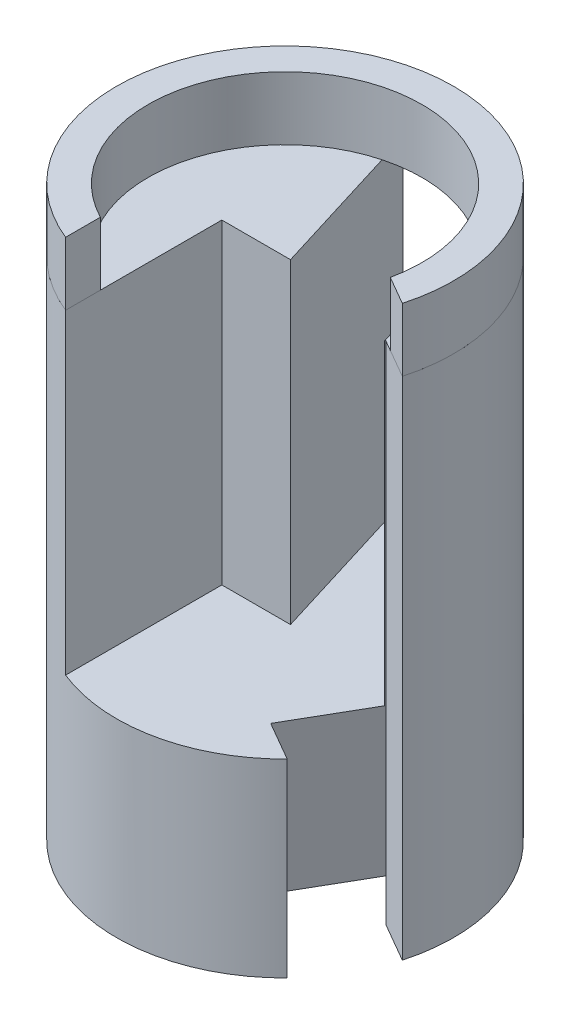
ISO-10303-21;
HEADER;
FILE_DESCRIPTION(('STEP AP214'),'2;1');
FILE_NAME('part.step','',(''),(''),'','','');
FILE_SCHEMA(('AUTOMOTIVE_DESIGN { 1 0 10303 214 1 1 1 1 }'));
ENDSEC;
DATA;
#1=APPLICATION_CONTEXT('core data for automotive mechanical design processes');
#2=APPLICATION_PROTOCOL_DEFINITION('international standard','automotive_design',2000,#1);
#3=PRODUCT_CONTEXT('',#1,'mechanical');
#4=PRODUCT('Part','Part','',(#3));
#5=PRODUCT_RELATED_PRODUCT_CATEGORY('part','',(#4));
#6=PRODUCT_DEFINITION_FORMATION('','',#4);
#7=PRODUCT_DEFINITION_CONTEXT('part definition',#1,'design');
#8=PRODUCT_DEFINITION('design','',#6,#7);
#9=PRODUCT_DEFINITION_SHAPE('','',#8);
#10=(LENGTH_UNIT() NAMED_UNIT(*) SI_UNIT(.MILLI.,.METRE.));
#11=(NAMED_UNIT(*) PLANE_ANGLE_UNIT() SI_UNIT($,.RADIAN.));
#12=(NAMED_UNIT(*) SI_UNIT($,.STERADIAN.) SOLID_ANGLE_UNIT());
#13=UNCERTAINTY_MEASURE_WITH_UNIT(LENGTH_MEASURE(1.E-05),#10,'distance_accuracy_value','');
#14=(GEOMETRIC_REPRESENTATION_CONTEXT(3) GLOBAL_UNCERTAINTY_ASSIGNED_CONTEXT((#13)) GLOBAL_UNIT_ASSIGNED_CONTEXT((#10,
#11,#12)) REPRESENTATION_CONTEXT('',''));
#15=CARTESIAN_POINT('',(0.,0.,0.));
#16=DIRECTION('',(0.,0.,1.));
#17=DIRECTION('',(1.,0.,0.));
#18=AXIS2_PLACEMENT_3D('',#15,#16,#17);
#19=CARTESIAN_POINT('',(0.,342.9,0.));
#20=DIRECTION('',(0.,1.,0.));
#21=DIRECTION('',(0.,0.,1.));
#22=AXIS2_PLACEMENT_3D('',#19,#20,#21);
#23=PLANE('',#22);
#24=CARTESIAN_POINT('',(0.,342.9,0.));
#25=DIRECTION('',(0.,1.,0.));
#26=DIRECTION('',(0.,0.,1.));
#27=AXIS2_PLACEMENT_3D('',#24,#25,#26);
#28=CIRCLE('',#27,82.55);
#29=CARTESIAN_POINT('',(80.7221057818705,342.9,17.2755358278843));
#30=VERTEX_POINT('',#29);
#31=CARTESIAN_POINT('',(-38.1,342.9,73.2317724761595));
#32=VERTEX_POINT('',#31);
#33=EDGE_CURVE('E107',#30,#32,#28,.T.);
#34=ORIENTED_EDGE('',*,*,#33,.F.);
#35=DIRECTION('',(0.866025403784435,0.,0.500000000000007));
#36=VECTOR('',#35,1.);
#37=CARTESIAN_POINT('',(74.2917267171491,342.9,13.562954743876));
#38=LINE('',#37,#36);
#39=CARTESIAN_POINT('',(97.8941899427417,342.9,27.1898432407104));
#40=VERTEX_POINT('',#39);
#41=EDGE_CURVE('E67',#30,#40,#38,.T.);
#42=ORIENTED_EDGE('',*,*,#41,.T.);
#43=CARTESIAN_POINT('',(0.,342.9,0.));
#44=DIRECTION('',(0.,1.,0.));
#45=DIRECTION('',(0.,0.,1.));
#46=AXIS2_PLACEMENT_3D('',#43,#44,#45);
#47=CIRCLE('',#46,101.6);
#48=CARTESIAN_POINT('',(-38.1,342.9,94.1857207861149));
#49=VERTEX_POINT('',#48);
#50=EDGE_CURVE('E106',#40,#49,#47,.T.);
#51=ORIENTED_EDGE('',*,*,#50,.T.);
#52=DIRECTION('',(0.,0.,1.));
#53=VECTOR('',#52,1.);
#54=CARTESIAN_POINT('',(-38.1,342.9,0.));
#55=LINE('',#54,#53);
#56=EDGE_CURVE('E101',#32,#49,#55,.T.);
#57=ORIENTED_EDGE('',*,*,#56,.F.);
#58=EDGE_LOOP('',(#34,#42,#51,#57));
#59=FACE_BOUND('',#58,.T.);
#60=ADVANCED_FACE('F54',(#59),#23,.T.);
#61=CARTESIAN_POINT('',(0.,304.8,0.));
#62=DIRECTION('',(0.,1.,0.));
#63=DIRECTION('',(0.,0.,1.));
#64=AXIS2_PLACEMENT_3D('',#61,#62,#63);
#65=PLANE('',#64);
#66=DIRECTION('',(0.866025403784435,0.,0.500000000000007));
#67=VECTOR('',#66,1.);
#68=CARTESIAN_POINT('',(12.7000000000001,304.8,-21.9970452561245));
#69=LINE('',#68,#67);
#70=CARTESIAN_POINT('',(80.7221057818705,304.8,17.2755358278843));
#71=VERTEX_POINT('',#70);
#72=CARTESIAN_POINT('',(97.8941899427417,304.8,27.1898432407104));
#73=VERTEX_POINT('',#72);
#74=EDGE_CURVE('E100',#71,#73,#69,.T.);
#75=ORIENTED_EDGE('',*,*,#74,.F.);
#76=CARTESIAN_POINT('',(0.,304.8,0.));
#77=DIRECTION('',(0.,1.,0.));
#78=DIRECTION('',(0.,0.,1.));
#79=AXIS2_PLACEMENT_3D('',#76,#77,#78);
#80=CIRCLE('',#79,82.55);
#81=CARTESIAN_POINT('',(-38.1,304.8,73.2317724761595));
#82=VERTEX_POINT('',#81);
#83=EDGE_CURVE('E77',#71,#82,#80,.T.);
#84=ORIENTED_EDGE('',*,*,#83,.T.);
#85=DIRECTION('',(0.,0.,1.));
#86=VECTOR('',#85,1.);
#87=CARTESIAN_POINT('',(-38.1,304.8,0.));
#88=LINE('',#87,#86);
#89=CARTESIAN_POINT('',(-38.1,304.8,94.1857207861149));
#90=VERTEX_POINT('',#89);
#91=EDGE_CURVE('E118',#82,#90,#88,.T.);
#92=ORIENTED_EDGE('',*,*,#91,.T.);
#93=CARTESIAN_POINT('',(0.,304.8,0.));
#94=DIRECTION('',(0.,1.,0.));
#95=DIRECTION('',(0.,0.,1.));
#96=AXIS2_PLACEMENT_3D('',#93,#94,#95);
#97=CIRCLE('',#96,101.6);
#98=EDGE_CURVE('E114',#73,#90,#97,.T.);
#99=ORIENTED_EDGE('',*,*,#98,.F.);
#100=EDGE_LOOP('',(#75,#84,#92,#99));
#101=FACE_BOUND('',#100,.T.);
#102=ADVANCED_FACE('F129',(#101),#65,.F.);
#103=CARTESIAN_POINT('',(0.,342.9,0.));
#104=DIRECTION('',(0.,-1.,0.));
#105=DIRECTION('',(0.,0.,-1.));
#106=AXIS2_PLACEMENT_3D('',#103,#104,#105);
#107=CYLINDRICAL_SURFACE('',#106,101.6);
#108=DIRECTION('',(0.,-1.,0.));
#109=VECTOR('',#108,1.);
#110=CARTESIAN_POINT('',(97.8941899427417,342.9,27.1898432407104));
#111=LINE('',#110,#109);
#112=EDGE_CURVE('E92',#73,#40,#111,.F.);
#113=ORIENTED_EDGE('',*,*,#112,.F.);
#114=ORIENTED_EDGE('',*,*,#98,.T.);
#115=DIRECTION('',(0.,1.,0.));
#116=VECTOR('',#115,1.);
#117=CARTESIAN_POINT('',(-38.1,114.3,94.1857207861149));
#118=LINE('',#117,#116);
#119=EDGE_CURVE('E115',#90,#49,#118,.T.);
#120=ORIENTED_EDGE('',*,*,#119,.T.);
#121=ORIENTED_EDGE('',*,*,#50,.F.);
#122=EDGE_LOOP('',(#113,#114,#120,#121));
#123=FACE_BOUND('',#122,.T.);
#124=ADVANCED_FACE('F60',(#123),#107,.T.);
#125=CARTESIAN_POINT('',(0.,342.9,0.));
#126=DIRECTION('',(0.,-1.,0.));
#127=DIRECTION('',(0.,0.,-1.));
#128=AXIS2_PLACEMENT_3D('',#125,#126,#127);
#129=CYLINDRICAL_SURFACE('',#128,82.55);
#130=ORIENTED_EDGE('',*,*,#83,.F.);
#131=DIRECTION('',(0.,-1.,0.));
#132=VECTOR('',#131,1.);
#133=CARTESIAN_POINT('',(80.7221057818705,342.9,17.2755358278843));
#134=LINE('',#133,#132);
#135=EDGE_CURVE('E12',#71,#30,#134,.F.);
#136=ORIENTED_EDGE('',*,*,#135,.T.);
#137=ORIENTED_EDGE('',*,*,#33,.T.);
#138=DIRECTION('',(0.,-1.,0.));
#139=VECTOR('',#138,1.);
#140=CARTESIAN_POINT('',(-38.1,342.9,73.2317724761595));
#141=LINE('',#140,#139);
#142=EDGE_CURVE('E64',#82,#32,#141,.F.);
#143=ORIENTED_EDGE('',*,*,#142,.F.);
#144=EDGE_LOOP('',(#130,#136,#137,#143));
#145=FACE_BOUND('',#144,.T.);
#146=ADVANCED_FACE('F126',(#145),#129,.F.);
#147=CARTESIAN_POINT('',(-38.1,114.3,0.));
#148=DIRECTION('',(-1.,0.,0.));
#149=DIRECTION('',(0.,0.,1.));
#150=AXIS2_PLACEMENT_3D('',#147,#148,#149);
#151=PLANE('',#150);
#152=ORIENTED_EDGE('',*,*,#142,.T.);
#153=ORIENTED_EDGE('',*,*,#56,.T.);
#154=ORIENTED_EDGE('',*,*,#119,.F.);
#155=ORIENTED_EDGE('',*,*,#91,.F.);
#156=EDGE_LOOP('',(#152,#153,#154,#155));
#157=FACE_BOUND('',#156,.T.);
#158=ADVANCED_FACE('F122',(#157),#151,.F.);
#159=CARTESIAN_POINT('',(74.2917267171491,-22.6727960055398,13.562954743876));
#160=DIRECTION('',(-0.500000000000007,0.,0.866025403784434));
#161=DIRECTION('',(0.866025403784435,0.,0.500000000000007));
#162=AXIS2_PLACEMENT_3D('',#159,#160,#161);
#163=PLANE('',#162);
#164=ORIENTED_EDGE('',*,*,#112,.T.);
#165=ORIENTED_EDGE('',*,*,#41,.F.);
#166=ORIENTED_EDGE('',*,*,#135,.F.);
#167=ORIENTED_EDGE('',*,*,#74,.T.);
#168=EDGE_LOOP('',(#164,#165,#166,#167));
#169=FACE_BOUND('',#168,.T.);
#170=ADVANCED_FACE('F96',(#169),#163,.T.);
#171=CLOSED_SHELL('',(#60,#102,#124,#146,#158,#170));
#172=MANIFOLD_SOLID_BREP('B2',#171);
#173=CARTESIAN_POINT('',(0.,304.8,0.));
#174=DIRECTION('',(0.,-1.,0.));
#175=DIRECTION('',(0.,0.,-1.));
#176=AXIS2_PLACEMENT_3D('',#173,#174,#175);
#177=CYLINDRICAL_SURFACE('',#176,101.6);
#178=DIRECTION('',(0.,-1.,0.));
#179=VECTOR('',#178,1.);
#180=CARTESIAN_POINT('',(97.8941899427417,304.8,27.1898432407104));
#181=LINE('',#180,#179);
#182=CARTESIAN_POINT('',(97.8941899427417,0.,27.1898432407104));
#183=VERTEX_POINT('',#182);
#184=CARTESIAN_POINT('',(97.8941899427417,304.8,27.1898432407104));
#185=VERTEX_POINT('',#184);
#186=EDGE_CURVE('E294',#183,#185,#181,.F.);
#187=ORIENTED_EDGE('',*,*,#186,.F.);
#188=CARTESIAN_POINT('',(0.,0.,0.));
#189=DIRECTION('',(0.,1.,0.));
#190=DIRECTION('',(0.,0.,1.));
#191=AXIS2_PLACEMENT_3D('',#188,#189,#190);
#192=CIRCLE('',#191,101.6);
#193=CARTESIAN_POINT('',(72.4941899427415,0.,71.1839337529595));
#194=VERTEX_POINT('',#193);
#195=EDGE_CURVE('E286',#183,#194,#192,.T.);
#196=ORIENTED_EDGE('',*,*,#195,.T.);
#197=DIRECTION('',(0.,-1.,0.));
#198=VECTOR('',#197,1.);
#199=CARTESIAN_POINT('',(72.4941899427415,304.8,71.1839337529594));
#200=LINE('',#199,#198);
#201=CARTESIAN_POINT('',(72.4941899427415,114.3,71.1839337529594));
#202=VERTEX_POINT('',#201);
#203=EDGE_CURVE('E366',#194,#202,#200,.F.);
#204=ORIENTED_EDGE('',*,*,#203,.T.);
#205=CARTESIAN_POINT('',(0.,114.3,0.));
#206=DIRECTION('',(0.,1.,0.));
#207=DIRECTION('',(0.,0.,1.));
#208=AXIS2_PLACEMENT_3D('',#205,#206,#207);
#209=CIRCLE('',#208,101.6);
#210=CARTESIAN_POINT('',(-38.1,114.3,94.1857207861149));
#211=VERTEX_POINT('',#210);
#212=EDGE_CURVE('E312',#211,#202,#209,.T.);
#213=ORIENTED_EDGE('',*,*,#212,.F.);
#214=DIRECTION('',(0.,1.,0.));
#215=VECTOR('',#214,1.);
#216=CARTESIAN_POINT('',(-38.1,114.3,94.1857207861149));
#217=LINE('',#216,#215);
#218=CARTESIAN_POINT('',(-38.1,304.8,94.1857207861149));
#219=VERTEX_POINT('',#218);
#220=EDGE_CURVE('E328',#211,#219,#217,.T.);
#221=ORIENTED_EDGE('',*,*,#220,.T.);
#222=CARTESIAN_POINT('',(0.,304.8,0.));
#223=DIRECTION('',(0.,1.,0.));
#224=DIRECTION('',(0.,0.,1.));
#225=AXIS2_PLACEMENT_3D('',#222,#223,#224);
#226=CIRCLE('',#225,101.6);
#227=CARTESIAN_POINT('',(-26.8844401083969,304.8,-97.9785021321413));
#228=VERTEX_POINT('',#227);
#229=EDGE_CURVE('E331',#228,#219,#226,.T.);
#230=ORIENTED_EDGE('',*,*,#229,.F.);
#231=DIRECTION('',(0.,1.,0.));
#232=VECTOR('',#231,1.);
#233=CARTESIAN_POINT('',(-26.8844401083969,114.3,-97.9785021321413));
#234=LINE('',#233,#232);
#235=CARTESIAN_POINT('',(-26.8844401083969,114.3,-97.9785021321413));
#236=VERTEX_POINT('',#235);
#237=EDGE_CURVE('E316',#236,#228,#234,.T.);
#238=ORIENTED_EDGE('',*,*,#237,.F.);
#239=CARTESIAN_POINT('',(0.,114.3,0.));
#240=DIRECTION('',(0.,1.,0.));
#241=DIRECTION('',(0.,0.,1.));
#242=AXIS2_PLACEMENT_3D('',#239,#240,#241);
#243=CIRCLE('',#242,101.6);
#244=CARTESIAN_POINT('',(41.1197496711301,114.3,-92.9070836211298));
#245=VERTEX_POINT('',#244);
#246=EDGE_CURVE('E303',#245,#236,#243,.T.);
#247=ORIENTED_EDGE('',*,*,#246,.F.);
#248=DIRECTION('',(0.,1.,0.));
#249=VECTOR('',#248,1.);
#250=CARTESIAN_POINT('',(41.1197496711301,114.3,-92.9070836211298));
#251=LINE('',#250,#249);
#252=CARTESIAN_POINT('',(41.1197496711301,304.8,-92.9070836211298));
#253=VERTEX_POINT('',#252);
#254=EDGE_CURVE('E306',#245,#253,#251,.T.);
#255=ORIENTED_EDGE('',*,*,#254,.T.);
#256=EDGE_CURVE('E336',#185,#253,#226,.T.);
#257=ORIENTED_EDGE('',*,*,#256,.F.);
#258=EDGE_LOOP('',(#187,#196,#204,#213,#221,#230,#238,#247,#255,#257));
#259=FACE_BOUND('',#258,.T.);
#260=ADVANCED_FACE('F178',(#259),#177,.T.);
#261=CARTESIAN_POINT('',(0.,0.,0.));
#262=DIRECTION('',(0.,1.,0.));
#263=DIRECTION('',(0.,0.,1.));
#264=AXIS2_PLACEMENT_3D('',#261,#262,#263);
#265=PLANE('',#264);
#266=DIRECTION('',(0.866025403784435,0.,0.500000000000007));
#267=VECTOR('',#266,1.);
#268=CARTESIAN_POINT('',(12.7000000000001,0.,-21.9970452561245));
#269=LINE('',#268,#267);
#270=CARTESIAN_POINT('',(74.9170394666926,0.,13.9239792281526));
#271=VERTEX_POINT('',#270);
#272=EDGE_CURVE('E271',#271,#183,#269,.T.);
#273=ORIENTED_EDGE('',*,*,#272,.F.);
#274=CARTESIAN_POINT('',(0.,0.,0.));
#275=DIRECTION('',(0.,-1.,0.));
#276=DIRECTION('',(0.,0.,-1.));
#277=AXIS2_PLACEMENT_3D('',#274,#275,#276);
#278=CIRCLE('',#277,76.2);
#279=CARTESIAN_POINT('',(49.5170394666924,0.,57.9180697404017));
#280=VERTEX_POINT('',#279);
#281=EDGE_CURVE('E285',#280,#271,#278,.T.);
#282=ORIENTED_EDGE('',*,*,#281,.F.);
#283=DIRECTION('',(0.866025403784435,0.,0.500000000000007));
#284=VECTOR('',#283,1.);
#285=CARTESIAN_POINT('',(-12.7000000000001,0.,21.9970452561245));
#286=LINE('',#285,#284);
#287=EDGE_CURVE('E290',#280,#194,#286,.T.);
#288=ORIENTED_EDGE('',*,*,#287,.T.);
#289=ORIENTED_EDGE('',*,*,#195,.F.);
#290=EDGE_LOOP('',(#273,#282,#288,#289));
#291=FACE_BOUND('',#290,.T.);
#292=ADVANCED_FACE('F284',(#291),#265,.F.);
#293=CARTESIAN_POINT('',(0.,25.4,0.));
#294=DIRECTION('',(0.,-1.,0.));
#295=DIRECTION('',(0.,0.,-1.));
#296=AXIS2_PLACEMENT_3D('',#293,#294,#295);
#297=CYLINDRICAL_SURFACE('',#296,76.2);
#298=DIRECTION('',(0.,-1.,0.));
#299=VECTOR('',#298,1.);
#300=CARTESIAN_POINT('',(74.9170394666926,25.4,13.9239792281526));
#301=LINE('',#300,#299);
#302=CARTESIAN_POINT('',(74.9170394666926,25.4,13.9239792281526));
#303=VERTEX_POINT('',#302);
#304=EDGE_CURVE('E268',#303,#271,#301,.T.);
#305=ORIENTED_EDGE('',*,*,#304,.F.);
#306=CARTESIAN_POINT('',(0.,25.4,0.));
#307=DIRECTION('',(0.,-1.,0.));
#308=DIRECTION('',(0.,0.,-1.));
#309=AXIS2_PLACEMENT_3D('',#306,#307,#308);
#310=CIRCLE('',#309,76.2);
#311=CARTESIAN_POINT('',(49.5170394666924,25.4,57.9180697404017));
#312=VERTEX_POINT('',#311);
#313=EDGE_CURVE('E291',#312,#303,#310,.T.);
#314=ORIENTED_EDGE('',*,*,#313,.F.);
#315=DIRECTION('',(0.,-1.,0.));
#316=VECTOR('',#315,1.);
#317=CARTESIAN_POINT('',(49.5170394666923,25.4,57.9180697404017));
#318=LINE('',#317,#316);
#319=EDGE_CURVE('E295',#312,#280,#318,.T.);
#320=ORIENTED_EDGE('',*,*,#319,.T.);
#321=ORIENTED_EDGE('',*,*,#281,.T.);
#322=EDGE_LOOP('',(#305,#314,#320,#321));
#323=FACE_BOUND('',#322,.T.);
#324=ADVANCED_FACE('F292',(#323),#297,.F.);
#325=CARTESIAN_POINT('',(0.,25.4,0.));
#326=DIRECTION('',(0.,-1.,0.));
#327=DIRECTION('',(0.,0.,-1.));
#328=AXIS2_PLACEMENT_3D('',#325,#326,#327);
#329=PLANE('',#328);
#330=ORIENTED_EDGE('',*,*,#313,.T.);
#331=DIRECTION('',(-0.866025403784435,0.,-0.500000000000007));
#332=VECTOR('',#331,1.);
#333=CARTESIAN_POINT('',(12.7000000000001,25.4,-21.9970452561245));
#334=LINE('',#333,#332);
#335=CARTESIAN_POINT('',(74.2917267171491,25.4,13.562954743876));
#336=VERTEX_POINT('',#335);
#337=EDGE_CURVE('E273',#303,#336,#334,.T.);
#338=ORIENTED_EDGE('',*,*,#337,.T.);
#339=DIRECTION('',(-0.500000000000007,0.,0.866025403784435));
#340=VECTOR('',#339,1.);
#341=CARTESIAN_POINT('',(61.591726717149,25.4,35.5600000000005));
#342=LINE('',#341,#340);
#343=CARTESIAN_POINT('',(48.8917267171488,25.4,57.557045256125));
#344=VERTEX_POINT('',#343);
#345=EDGE_CURVE('E276',#336,#344,#342,.T.);
#346=ORIENTED_EDGE('',*,*,#345,.T.);
#347=DIRECTION('',(-0.866025403784435,0.,-0.500000000000007));
#348=VECTOR('',#347,1.);
#349=CARTESIAN_POINT('',(-12.7000000000001,25.4,21.9970452561245));
#350=LINE('',#349,#348);
#351=EDGE_CURVE('E52',#312,#344,#350,.T.);
#352=ORIENTED_EDGE('',*,*,#351,.F.);
#353=EDGE_LOOP('',(#330,#338,#346,#352));
#354=FACE_BOUND('',#353,.T.);
#355=ADVANCED_FACE('F411',(#354),#329,.T.);
#356=CARTESIAN_POINT('',(0.,304.8,0.));
#357=DIRECTION('',(0.,1.,0.));
#358=DIRECTION('',(0.,0.,1.));
#359=AXIS2_PLACEMENT_3D('',#356,#357,#358);
#360=PLANE('',#359);
#361=DIRECTION('',(0.500000000000007,0.,-0.866025403784435));
#362=VECTOR('',#361,1.);
#363=CARTESIAN_POINT('',(61.591726717149,304.8,35.5600000000005));
#364=LINE('',#363,#362);
#365=CARTESIAN_POINT('',(74.040017302983,304.8,13.998928237955));
#366=VERTEX_POINT('',#365);
#367=CARTESIAN_POINT('',(74.2917267171491,304.8,13.562954743876));
#368=VERTEX_POINT('',#367);
#369=EDGE_CURVE('E299',#366,#368,#364,.T.);
#370=ORIENTED_EDGE('',*,*,#369,.T.);
#371=DIRECTION('',(0.866025403784435,0.,0.500000000000007));
#372=VECTOR('',#371,1.);
#373=CARTESIAN_POINT('',(12.7000000000001,304.8,-21.9970452561245));
#374=LINE('',#373,#372);
#375=EDGE_CURVE('E186',#368,#185,#374,.T.);
#376=ORIENTED_EDGE('',*,*,#375,.T.);
#377=ORIENTED_EDGE('',*,*,#256,.T.);
#378=DIRECTION('',(0.29429907218243,0.,0.955713375501547));
#379=VECTOR('',#378,1.);
#380=CARTESIAN_POINT('',(63.6898510931092,304.8,-19.6124325185913));
#381=LINE('',#380,#379);
#382=EDGE_CURVE('E296',#253,#366,#381,.T.);
#383=ORIENTED_EDGE('',*,*,#382,.T.);
#384=EDGE_LOOP('',(#370,#376,#377,#383));
#385=FACE_BOUND('',#384,.T.);
#386=ADVANCED_FACE('F348',(#385),#360,.T.);
#387=CARTESIAN_POINT('',(63.6898510931092,114.3,-19.6124325185913));
#388=DIRECTION('',(-0.955713375501547,0.,0.29429907218243));
#389=DIRECTION('',(0.29429907218243,0.,0.955713375501547));
#390=AXIS2_PLACEMENT_3D('',#387,#388,#389);
#391=PLANE('',#390);
#392=DIRECTION('',(0.29429907218243,0.,0.955713375501547));
#393=VECTOR('',#392,1.);
#394=CARTESIAN_POINT('',(63.6898510931092,114.3,-19.6124325185913));
#395=LINE('',#394,#393);
#396=CARTESIAN_POINT('',(74.040017302983,114.3,13.998928237955));
#397=VERTEX_POINT('',#396);
#398=EDGE_CURVE('E304',#245,#397,#395,.T.);
#399=ORIENTED_EDGE('',*,*,#398,.T.);
#400=DIRECTION('',(0.,1.,0.));
#401=VECTOR('',#400,1.);
#402=CARTESIAN_POINT('',(74.040017302983,114.3,13.998928237955));
#403=LINE('',#402,#401);
#404=EDGE_CURVE('E343',#397,#366,#403,.T.);
#405=ORIENTED_EDGE('',*,*,#404,.T.);
#406=ORIENTED_EDGE('',*,*,#382,.F.);
#407=ORIENTED_EDGE('',*,*,#254,.F.);
#408=EDGE_LOOP('',(#399,#405,#406,#407));
#409=FACE_BOUND('',#408,.T.);
#410=ADVANCED_FACE('F360',(#409),#391,.T.);
#411=DIRECTION('',(0.294299072182429,0.,0.955713375501547));
#412=VECTOR('',#411,1.);
#413=CARTESIAN_POINT('',(3.00205174876095,304.8,-0.924441435006951));
#414=LINE('',#413,#412);
#415=CARTESIAN_POINT('',(3.28672104771972,304.8,0.));
#416=VERTEX_POINT('',#415);
#417=EDGE_CURVE('E302',#228,#416,#414,.T.);
#418=ORIENTED_EDGE('',*,*,#417,.F.);
#419=ORIENTED_EDGE('',*,*,#229,.T.);
#420=DIRECTION('',(0.,0.,1.));
#421=VECTOR('',#420,1.);
#422=CARTESIAN_POINT('',(-38.1,304.8,0.));
#423=LINE('',#422,#421);
#424=CARTESIAN_POINT('',(-38.1,304.8,0.));
#425=VERTEX_POINT('',#424);
#426=EDGE_CURVE('E344',#425,#219,#423,.T.);
#427=ORIENTED_EDGE('',*,*,#426,.F.);
#428=DIRECTION('',(1.,0.,0.));
#429=VECTOR('',#428,1.);
#430=CARTESIAN_POINT('',(0.,304.8,0.));
#431=LINE('',#430,#429);
#432=EDGE_CURVE('E339',#425,#416,#431,.T.);
#433=ORIENTED_EDGE('',*,*,#432,.T.);
#434=EDGE_LOOP('',(#418,#419,#427,#433));
#435=FACE_BOUND('',#434,.T.);
#436=ADVANCED_FACE('F389',(#435),#360,.T.);
#437=CARTESIAN_POINT('',(-38.1,114.3,0.));
#438=DIRECTION('',(-1.,0.,0.));
#439=DIRECTION('',(0.,0.,1.));
#440=AXIS2_PLACEMENT_3D('',#437,#438,#439);
#441=PLANE('',#440);
#442=ORIENTED_EDGE('',*,*,#426,.T.);
#443=ORIENTED_EDGE('',*,*,#220,.F.);
#444=DIRECTION('',(0.,0.,1.));
#445=VECTOR('',#444,1.);
#446=CARTESIAN_POINT('',(-38.1,114.3,0.));
#447=LINE('',#446,#445);
#448=CARTESIAN_POINT('',(-38.1,114.3,0.));
#449=VERTEX_POINT('',#448);
#450=EDGE_CURVE('E324',#449,#211,#447,.T.);
#451=ORIENTED_EDGE('',*,*,#450,.F.);
#452=DIRECTION('',(0.,1.,0.));
#453=VECTOR('',#452,1.);
#454=CARTESIAN_POINT('',(-38.1,114.3,0.));
#455=LINE('',#454,#453);
#456=EDGE_CURVE('E327',#449,#425,#455,.T.);
#457=ORIENTED_EDGE('',*,*,#456,.T.);
#458=EDGE_LOOP('',(#442,#443,#451,#457));
#459=FACE_BOUND('',#458,.T.);
#460=ADVANCED_FACE('F382',(#459),#441,.F.);
#461=CARTESIAN_POINT('',(0.,114.3,0.));
#462=DIRECTION('',(0.,0.,1.));
#463=DIRECTION('',(1.,0.,0.));
#464=AXIS2_PLACEMENT_3D('',#461,#462,#463);
#465=PLANE('',#464);
#466=DIRECTION('',(0.,1.,0.));
#467=VECTOR('',#466,1.);
#468=CARTESIAN_POINT('',(3.28672104771972,114.3,0.));
#469=LINE('',#468,#467);
#470=CARTESIAN_POINT('',(3.28672104771972,114.3,0.));
#471=VERTEX_POINT('',#470);
#472=EDGE_CURVE('E315',#471,#416,#469,.T.);
#473=ORIENTED_EDGE('',*,*,#472,.T.);
#474=ORIENTED_EDGE('',*,*,#432,.F.);
#475=ORIENTED_EDGE('',*,*,#456,.F.);
#476=DIRECTION('',(1.,0.,0.));
#477=VECTOR('',#476,1.);
#478=CARTESIAN_POINT('',(0.,114.3,0.));
#479=LINE('',#478,#477);
#480=EDGE_CURVE('E325',#449,#471,#479,.T.);
#481=ORIENTED_EDGE('',*,*,#480,.T.);
#482=EDGE_LOOP('',(#473,#474,#475,#481));
#483=FACE_BOUND('',#482,.T.);
#484=ADVANCED_FACE('F392',(#483),#465,.T.);
#485=CARTESIAN_POINT('',(0.,114.3,0.));
#486=DIRECTION('',(0.,1.,0.));
#487=DIRECTION('',(0.,0.,1.));
#488=AXIS2_PLACEMENT_3D('',#485,#486,#487);
#489=PLANE('',#488);
#490=DIRECTION('',(0.866025403784435,0.,0.500000000000007));
#491=VECTOR('',#490,1.);
#492=CARTESIAN_POINT('',(-12.7000000000001,114.3,21.9970452561245));
#493=LINE('',#492,#491);
#494=CARTESIAN_POINT('',(48.8917267171488,114.3,57.557045256125));
#495=VERTEX_POINT('',#494);
#496=EDGE_CURVE('E361',#495,#202,#493,.T.);
#497=ORIENTED_EDGE('',*,*,#496,.F.);
#498=DIRECTION('',(0.500000000000007,0.,-0.866025403784435));
#499=VECTOR('',#498,1.);
#500=CARTESIAN_POINT('',(61.591726717149,114.3,35.5600000000005));
#501=LINE('',#500,#499);
#502=EDGE_CURVE('E363',#495,#397,#501,.T.);
#503=ORIENTED_EDGE('',*,*,#502,.T.);
#504=ORIENTED_EDGE('',*,*,#398,.F.);
#505=ORIENTED_EDGE('',*,*,#246,.T.);
#506=DIRECTION('',(0.294299072182429,0.,0.955713375501547));
#507=VECTOR('',#506,1.);
#508=CARTESIAN_POINT('',(3.00205174876095,114.3,-0.924441435006951));
#509=LINE('',#508,#507);
#510=EDGE_CURVE('E199',#236,#471,#509,.T.);
#511=ORIENTED_EDGE('',*,*,#510,.T.);
#512=ORIENTED_EDGE('',*,*,#480,.F.);
#513=ORIENTED_EDGE('',*,*,#450,.T.);
#514=ORIENTED_EDGE('',*,*,#212,.T.);
#515=EDGE_LOOP('',(#497,#503,#504,#505,#511,#512,#513,#514));
#516=FACE_BOUND('',#515,.T.);
#517=ADVANCED_FACE('F357',(#516),#489,.T.);
#518=CARTESIAN_POINT('',(3.00205174876095,114.3,-0.924441435006951));
#519=DIRECTION('',(-0.955713375501547,0.,0.294299072182429));
#520=DIRECTION('',(0.294299072182429,0.,0.955713375501547));
#521=AXIS2_PLACEMENT_3D('',#518,#519,#520);
#522=PLANE('',#521);
#523=ORIENTED_EDGE('',*,*,#417,.T.);
#524=ORIENTED_EDGE('',*,*,#472,.F.);
#525=ORIENTED_EDGE('',*,*,#510,.F.);
#526=ORIENTED_EDGE('',*,*,#237,.T.);
#527=EDGE_LOOP('',(#523,#524,#525,#526));
#528=FACE_BOUND('',#527,.T.);
#529=ADVANCED_FACE('F388',(#528),#522,.F.);
#530=CARTESIAN_POINT('',(74.2917267171491,-22.6727960055398,13.562954743876));
#531=DIRECTION('',(-0.500000000000007,0.,0.866025403784434));
#532=DIRECTION('',(0.866025403784435,0.,0.500000000000007));
#533=AXIS2_PLACEMENT_3D('',#530,#531,#532);
#534=PLANE('',#533);
#535=ORIENTED_EDGE('',*,*,#186,.T.);
#536=ORIENTED_EDGE('',*,*,#375,.F.);
#537=DIRECTION('',(0.,1.,0.));
#538=VECTOR('',#537,1.);
#539=CARTESIAN_POINT('',(74.2917267171491,-22.6727960055398,13.562954743876));
#540=LINE('',#539,#538);
#541=EDGE_CURVE('E368',#336,#368,#540,.T.);
#542=ORIENTED_EDGE('',*,*,#541,.F.);
#543=ORIENTED_EDGE('',*,*,#337,.F.);
#544=ORIENTED_EDGE('',*,*,#304,.T.);
#545=ORIENTED_EDGE('',*,*,#272,.T.);
#546=EDGE_LOOP('',(#535,#536,#542,#543,#544,#545));
#547=FACE_BOUND('',#546,.T.);
#548=ADVANCED_FACE('F269',(#547),#534,.T.);
#549=CARTESIAN_POINT('',(48.8917267171489,-22.6727960055398,57.557045256125));
#550=DIRECTION('',(0.866025403784434,0.,0.500000000000007));
#551=DIRECTION('',(0.500000000000007,0.,-0.866025403784435));
#552=AXIS2_PLACEMENT_3D('',#549,#550,#551);
#553=PLANE('',#552);
#554=ORIENTED_EDGE('',*,*,#404,.F.);
#555=ORIENTED_EDGE('',*,*,#502,.F.);
#556=DIRECTION('',(0.,1.,0.));
#557=VECTOR('',#556,1.);
#558=CARTESIAN_POINT('',(48.8917267171488,0.,57.557045256125));
#559=LINE('',#558,#557);
#560=EDGE_CURVE('E195',#344,#495,#559,.T.);
#561=ORIENTED_EDGE('',*,*,#560,.F.);
#562=ORIENTED_EDGE('',*,*,#345,.F.);
#563=ORIENTED_EDGE('',*,*,#541,.T.);
#564=ORIENTED_EDGE('',*,*,#369,.F.);
#565=EDGE_LOOP('',(#554,#555,#561,#562,#563,#564));
#566=FACE_BOUND('',#565,.T.);
#567=ADVANCED_FACE('F364',(#566),#553,.T.);
#568=CARTESIAN_POINT('',(-12.7000000000001,0.,21.9970452561245));
#569=DIRECTION('',(-0.500000000000007,0.,0.866025403784435));
#570=DIRECTION('',(0.866025403784435,0.,0.500000000000007));
#571=AXIS2_PLACEMENT_3D('',#568,#569,#570);
#572=PLANE('',#571);
#573=ORIENTED_EDGE('',*,*,#287,.F.);
#574=ORIENTED_EDGE('',*,*,#319,.F.);
#575=ORIENTED_EDGE('',*,*,#351,.T.);
#576=ORIENTED_EDGE('',*,*,#560,.T.);
#577=ORIENTED_EDGE('',*,*,#496,.T.);
#578=ORIENTED_EDGE('',*,*,#203,.F.);
#579=EDGE_LOOP('',(#573,#574,#575,#576,#577,#578));
#580=FACE_BOUND('',#579,.T.);
#581=ADVANCED_FACE('F432',(#580),#572,.F.);
#582=CLOSED_SHELL('',(#260,#292,#324,#355,#386,#410,#436,#460,#484,#517,#529,#548,#567,#581));
#583=MANIFOLD_SOLID_BREP('B6',#582);
#584=ADVANCED_BREP_SHAPE_REPRESENTATION('',(#18,#172,#583),#14);
#585=SHAPE_DEFINITION_REPRESENTATION(#9,#584);
ENDSEC;
END-ISO-10303-21;
